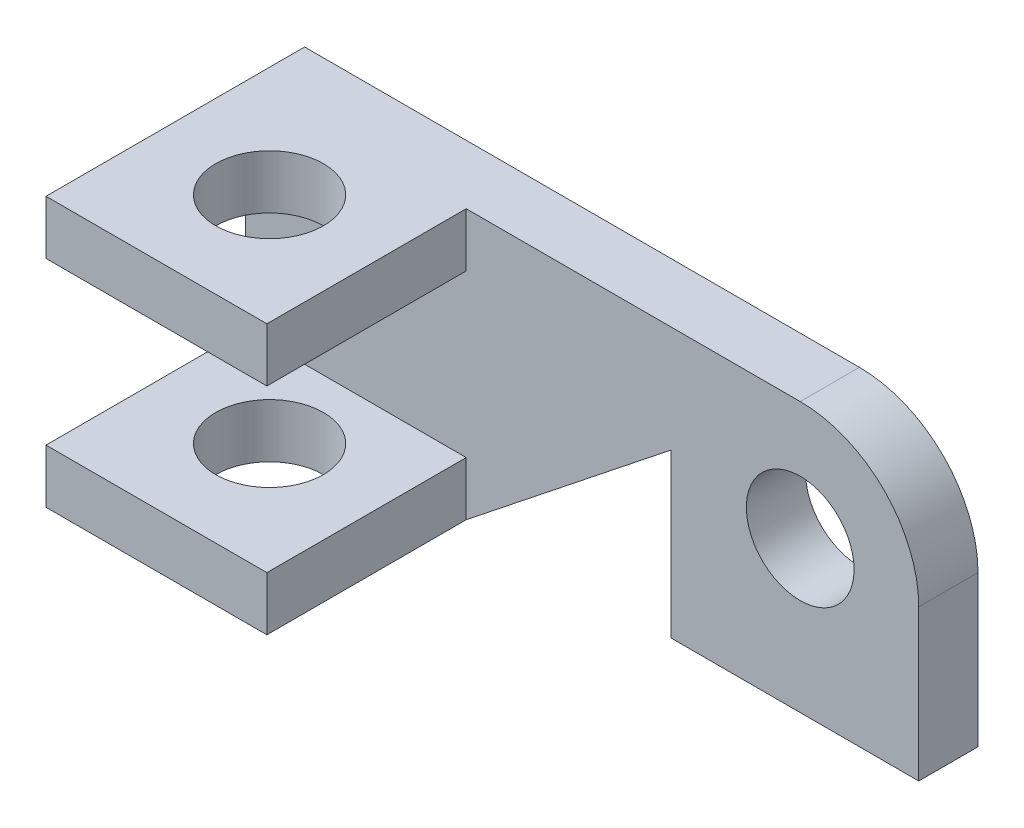
ISO-10303-21;
HEADER;
FILE_DESCRIPTION(('STEP AP214'),'2;1');
FILE_NAME('part.step','',(''),(''),'','','');
FILE_SCHEMA(('AUTOMOTIVE_DESIGN { 1 0 10303 214 1 1 1 1 }'));
ENDSEC;
DATA;
#1=APPLICATION_CONTEXT('core data for automotive mechanical design processes');
#2=APPLICATION_PROTOCOL_DEFINITION('international standard','automotive_design',2000,#1);
#3=PRODUCT_CONTEXT('',#1,'mechanical');
#4=PRODUCT('Part','Part','',(#3));
#5=PRODUCT_RELATED_PRODUCT_CATEGORY('part','',(#4));
#6=PRODUCT_DEFINITION_FORMATION('','',#4);
#7=PRODUCT_DEFINITION_CONTEXT('part definition',#1,'design');
#8=PRODUCT_DEFINITION('design','',#6,#7);
#9=PRODUCT_DEFINITION_SHAPE('','',#8);
#10=(LENGTH_UNIT() NAMED_UNIT(*) SI_UNIT(.MILLI.,.METRE.));
#11=(NAMED_UNIT(*) PLANE_ANGLE_UNIT() SI_UNIT($,.RADIAN.));
#12=(NAMED_UNIT(*) SI_UNIT($,.STERADIAN.) SOLID_ANGLE_UNIT());
#13=UNCERTAINTY_MEASURE_WITH_UNIT(LENGTH_MEASURE(1.E-05),#10,'distance_accuracy_value','');
#14=(GEOMETRIC_REPRESENTATION_CONTEXT(3) GLOBAL_UNCERTAINTY_ASSIGNED_CONTEXT((#13)) GLOBAL_UNIT_ASSIGNED_CONTEXT((#10,
#11,#12)) REPRESENTATION_CONTEXT('',''));
#15=CARTESIAN_POINT('',(0.,0.,0.));
#16=DIRECTION('',(0.,0.,1.));
#17=DIRECTION('',(1.,0.,0.));
#18=AXIS2_PLACEMENT_3D('',#15,#16,#17);
#19=CARTESIAN_POINT('',(103000.,28000.,11000.));
#20=DIRECTION('',(0.,0.,-1.));
#21=DIRECTION('',(-1.,0.,0.));
#22=AXIS2_PLACEMENT_3D('',#19,#20,#21);
#23=PLANE('',#22);
#24=CARTESIAN_POINT('',(103000.,28000.,11000.));
#25=DIRECTION('',(0.,0.,1.));
#26=DIRECTION('',(1.,0.,0.));
#27=AXIS2_PLACEMENT_3D('',#24,#25,#26);
#28=CIRCLE('',#27,10000.);
#29=CARTESIAN_POINT('',(113000.,28000.,11000.));
#30=VERTEX_POINT('',#29);
#31=EDGE_CURVE('E206',#30,#30,#28,.T.);
#32=ORIENTED_EDGE('',*,*,#31,.F.);
#33=EDGE_LOOP('',(#32));
#34=FACE_BOUND('',#33,.T.);
#35=DIRECTION('',(-1.,0.,0.));
#36=VECTOR('',#35,1.);
#37=CARTESIAN_POINT('',(4.16528467062881E-10,10000.,11000.));
#38=LINE('',#37,#36);
#39=CARTESIAN_POINT('',(41000.0000000004,10000.,11000.));
#40=VERTEX_POINT('',#39);
#41=CARTESIAN_POINT('',(0.,10000.,11000.));
#42=VERTEX_POINT('',#41);
#43=EDGE_CURVE('E56',#40,#42,#38,.T.);
#44=ORIENTED_EDGE('',*,*,#43,.F.);
#45=DIRECTION('',(0.,1.,0.));
#46=VECTOR('',#45,1.);
#47=CARTESIAN_POINT('',(41000.0000000004,10000.,11000.));
#48=LINE('',#47,#46);
#49=CARTESIAN_POINT('',(41000.0000000004,0.,11000.));
#50=VERTEX_POINT('',#49);
#51=EDGE_CURVE('E159',#50,#40,#48,.T.);
#52=ORIENTED_EDGE('',*,*,#51,.F.);
#53=DIRECTION('',(0.782900608144122,0.622146797602916,0.));
#54=VECTOR('',#53,1.);
#55=CARTESIAN_POINT('',(41000.,0.,11000.));
#56=LINE('',#55,#54);
#57=CARTESIAN_POINT('',(79000.,30197.4197784232,11000.));
#58=VERTEX_POINT('',#57);
#59=EDGE_CURVE('E231',#50,#58,#56,.T.);
#60=ORIENTED_EDGE('',*,*,#59,.T.);
#61=DIRECTION('',(0.,-1.,0.));
#62=VECTOR('',#61,1.);
#63=CARTESIAN_POINT('',(79000.,30197.4197784232,11000.));
#64=LINE('',#63,#62);
#65=CARTESIAN_POINT('',(79000.,1.4210854715202E-11,11000.));
#66=VERTEX_POINT('',#65);
#67=EDGE_CURVE('E234',#58,#66,#64,.T.);
#68=ORIENTED_EDGE('',*,*,#67,.T.);
#69=DIRECTION('',(1.,0.,0.));
#70=VECTOR('',#69,1.);
#71=CARTESIAN_POINT('',(79000.,1.4210854715202E-11,11000.));
#72=LINE('',#71,#70);
#73=CARTESIAN_POINT('',(125000.,1.4210854715202E-11,11000.));
#74=VERTEX_POINT('',#73);
#75=EDGE_CURVE('E214',#66,#74,#72,.T.);
#76=ORIENTED_EDGE('',*,*,#75,.T.);
#77=DIRECTION('',(0.,1.,0.));
#78=VECTOR('',#77,1.);
#79=CARTESIAN_POINT('',(125000.,1.4210854715202E-11,11000.));
#80=LINE('',#79,#78);
#81=CARTESIAN_POINT('',(125000.,28000.,11000.));
#82=VERTEX_POINT('',#81);
#83=EDGE_CURVE('E218',#74,#82,#80,.T.);
#84=ORIENTED_EDGE('',*,*,#83,.T.);
#85=CARTESIAN_POINT('',(103000.,28000.,11000.));
#86=DIRECTION('',(0.,0.,-1.));
#87=DIRECTION('',(-1.,0.,0.));
#88=AXIS2_PLACEMENT_3D('',#85,#86,#87);
#89=CIRCLE('',#88,22000.);
#90=CARTESIAN_POINT('',(103000.,50000.,11000.));
#91=VERTEX_POINT('',#90);
#92=EDGE_CURVE('E222',#91,#82,#89,.T.);
#93=ORIENTED_EDGE('',*,*,#92,.F.);
#94=DIRECTION('',(-1.,0.,0.));
#95=VECTOR('',#94,1.);
#96=CARTESIAN_POINT('',(103000.,50000.,11000.));
#97=LINE('',#96,#95);
#98=CARTESIAN_POINT('',(41000.,50000.,11000.));
#99=VERTEX_POINT('',#98);
#100=EDGE_CURVE('E226',#91,#99,#97,.T.);
#101=ORIENTED_EDGE('',*,*,#100,.T.);
#102=DIRECTION('',(0.,1.,0.));
#103=VECTOR('',#102,1.);
#104=CARTESIAN_POINT('',(41000.,50000.,11000.));
#105=LINE('',#104,#103);
#106=CARTESIAN_POINT('',(41000.,40000.,11000.));
#107=VERTEX_POINT('',#106);
#108=EDGE_CURVE('E169',#107,#99,#105,.T.);
#109=ORIENTED_EDGE('',*,*,#108,.F.);
#110=DIRECTION('',(1.,0.,0.));
#111=VECTOR('',#110,1.);
#112=CARTESIAN_POINT('',(1.22464679914735E-12,40000.,11000.));
#113=LINE('',#112,#111);
#114=CARTESIAN_POINT('',(0.,40000.,11000.));
#115=VERTEX_POINT('',#114);
#116=EDGE_CURVE('E163',#115,#107,#113,.T.);
#117=ORIENTED_EDGE('',*,*,#116,.F.);
#118=DIRECTION('',(0.,-1.,0.));
#119=VECTOR('',#118,1.);
#120=CARTESIAN_POINT('',(0.,50000.,11000.));
#121=LINE('',#120,#119);
#122=EDGE_CURVE('E61',#115,#42,#121,.T.);
#123=ORIENTED_EDGE('',*,*,#122,.T.);
#124=EDGE_LOOP('',(#44,#52,#60,#68,#76,#84,#93,#101,#109,#117,#123));
#125=FACE_BOUND('',#124,.T.);
#126=ADVANCED_FACE('F39',(#34,#125),#23,.F.);
#127=CARTESIAN_POINT('',(79000.,1.4210854715202E-11,11000.));
#128=DIRECTION('',(0.,1.,0.));
#129=DIRECTION('',(0.,0.,1.));
#130=AXIS2_PLACEMENT_3D('',#127,#128,#129);
#131=PLANE('',#130);
#132=DIRECTION('',(1.,0.,0.));
#133=VECTOR('',#132,1.);
#134=CARTESIAN_POINT('',(79000.,1.4210854715202E-11,0.));
#135=LINE('',#134,#133);
#136=CARTESIAN_POINT('',(79000.,1.4210854715202E-11,0.));
#137=VERTEX_POINT('',#136);
#138=CARTESIAN_POINT('',(125000.,1.4210854715202E-11,0.));
#139=VERTEX_POINT('',#138);
#140=EDGE_CURVE('E210',#137,#139,#135,.T.);
#141=ORIENTED_EDGE('',*,*,#140,.T.);
#142=DIRECTION('',(0.,0.,-1.));
#143=VECTOR('',#142,1.);
#144=CARTESIAN_POINT('',(125000.,1.4210854715202E-11,11000.));
#145=LINE('',#144,#143);
#146=EDGE_CURVE('E11',#74,#139,#145,.T.);
#147=ORIENTED_EDGE('',*,*,#146,.F.);
#148=ORIENTED_EDGE('',*,*,#75,.F.);
#149=DIRECTION('',(0.,0.,-1.));
#150=VECTOR('',#149,1.);
#151=CARTESIAN_POINT('',(79000.,1.4210854715202E-11,11000.));
#152=LINE('',#151,#150);
#153=EDGE_CURVE('E237',#66,#137,#152,.T.);
#154=ORIENTED_EDGE('',*,*,#153,.T.);
#155=EDGE_LOOP('',(#141,#147,#148,#154));
#156=FACE_BOUND('',#155,.T.);
#157=ADVANCED_FACE('F41',(#156),#131,.F.);
#158=CARTESIAN_POINT('',(125000.,1.4210854715202E-11,11000.));
#159=DIRECTION('',(-1.,0.,0.));
#160=DIRECTION('',(0.,0.,1.));
#161=AXIS2_PLACEMENT_3D('',#158,#159,#160);
#162=PLANE('',#161);
#163=DIRECTION('',(0.,1.,0.));
#164=VECTOR('',#163,1.);
#165=CARTESIAN_POINT('',(125000.,1.4210854715202E-11,0.));
#166=LINE('',#165,#164);
#167=CARTESIAN_POINT('',(125000.,28000.,0.));
#168=VERTEX_POINT('',#167);
#169=EDGE_CURVE('E241',#139,#168,#166,.T.);
#170=ORIENTED_EDGE('',*,*,#169,.T.);
#171=DIRECTION('',(0.,0.,-1.));
#172=VECTOR('',#171,1.);
#173=CARTESIAN_POINT('',(125000.,28000.,11000.));
#174=LINE('',#173,#172);
#175=EDGE_CURVE('E49',#82,#168,#174,.T.);
#176=ORIENTED_EDGE('',*,*,#175,.F.);
#177=ORIENTED_EDGE('',*,*,#83,.F.);
#178=ORIENTED_EDGE('',*,*,#146,.T.);
#179=EDGE_LOOP('',(#170,#176,#177,#178));
#180=FACE_BOUND('',#179,.T.);
#181=ADVANCED_FACE('F290',(#180),#162,.F.);
#182=CARTESIAN_POINT('',(103000.,28000.,11000.));
#183=DIRECTION('',(0.,0.,-1.));
#184=DIRECTION('',(-1.,0.,0.));
#185=AXIS2_PLACEMENT_3D('',#182,#183,#184);
#186=CYLINDRICAL_SURFACE('',#185,22000.);
#187=CARTESIAN_POINT('',(103000.,28000.,0.));
#188=DIRECTION('',(0.,0.,-1.));
#189=DIRECTION('',(-1.,0.,0.));
#190=AXIS2_PLACEMENT_3D('',#187,#188,#189);
#191=CIRCLE('',#190,22000.);
#192=CARTESIAN_POINT('',(103000.,50000.,0.));
#193=VERTEX_POINT('',#192);
#194=EDGE_CURVE('E245',#193,#168,#191,.T.);
#195=ORIENTED_EDGE('',*,*,#194,.F.);
#196=DIRECTION('',(0.,0.,-1.));
#197=VECTOR('',#196,1.);
#198=CARTESIAN_POINT('',(103000.,50000.,11000.));
#199=LINE('',#198,#197);
#200=EDGE_CURVE('E280',#91,#193,#199,.T.);
#201=ORIENTED_EDGE('',*,*,#200,.F.);
#202=ORIENTED_EDGE('',*,*,#92,.T.);
#203=ORIENTED_EDGE('',*,*,#175,.T.);
#204=EDGE_LOOP('',(#195,#201,#202,#203));
#205=FACE_BOUND('',#204,.T.);
#206=ADVANCED_FACE('F287',(#205),#186,.T.);
#207=CARTESIAN_POINT('',(103000.,50000.,11000.));
#208=DIRECTION('',(0.,-1.,0.));
#209=DIRECTION('',(1.,0.,0.));
#210=AXIS2_PLACEMENT_3D('',#207,#208,#209);
#211=PLANE('',#210);
#212=CARTESIAN_POINT('',(20500.0000000004,50000.,27000.));
#213=DIRECTION('',(0.,-1.,0.));
#214=DIRECTION('',(0.,0.,-1.));
#215=AXIS2_PLACEMENT_3D('',#212,#213,#214);
#216=CIRCLE('',#215,10000.);
#217=CARTESIAN_POINT('',(20500.0000000004,50000.,17000.));
#218=VERTEX_POINT('',#217);
#219=EDGE_CURVE('E485',#218,#218,#216,.T.);
#220=ORIENTED_EDGE('',*,*,#219,.T.);
#221=EDGE_LOOP('',(#220));
#222=FACE_BOUND('',#221,.T.);
#223=DIRECTION('',(-1.,0.,0.));
#224=VECTOR('',#223,1.);
#225=CARTESIAN_POINT('',(103000.,50000.,0.));
#226=LINE('',#225,#224);
#227=CARTESIAN_POINT('',(0.,50000.,0.));
#228=VERTEX_POINT('',#227);
#229=EDGE_CURVE('E249',#193,#228,#226,.T.);
#230=ORIENTED_EDGE('',*,*,#229,.T.);
#231=DIRECTION('',(0.,0.,-1.));
#232=VECTOR('',#231,1.);
#233=CARTESIAN_POINT('',(0.,50000.,11000.));
#234=LINE('',#233,#232);
#235=CARTESIAN_POINT('',(0.,50000.,48000.));
#236=VERTEX_POINT('',#235);
#237=EDGE_CURVE('E276',#236,#228,#234,.T.);
#238=ORIENTED_EDGE('',*,*,#237,.F.);
#239=DIRECTION('',(-1.,0.,0.));
#240=VECTOR('',#239,1.);
#241=CARTESIAN_POINT('',(0.,50000.,48000.));
#242=LINE('',#241,#240);
#243=CARTESIAN_POINT('',(41000.,50000.,48000.));
#244=VERTEX_POINT('',#243);
#245=EDGE_CURVE('E186',#244,#236,#242,.T.);
#246=ORIENTED_EDGE('',*,*,#245,.F.);
#247=DIRECTION('',(0.,0.,-1.));
#248=VECTOR('',#247,1.);
#249=CARTESIAN_POINT('',(41000.,50000.,48000.));
#250=LINE('',#249,#248);
#251=EDGE_CURVE('E189',#244,#99,#250,.T.);
#252=ORIENTED_EDGE('',*,*,#251,.T.);
#253=ORIENTED_EDGE('',*,*,#100,.F.);
#254=ORIENTED_EDGE('',*,*,#200,.T.);
#255=EDGE_LOOP('',(#230,#238,#246,#252,#253,#254));
#256=FACE_BOUND('',#255,.T.);
#257=ADVANCED_FACE('F299',(#222,#256),#211,.F.);
#258=CARTESIAN_POINT('',(0.,50000.,11000.));
#259=DIRECTION('',(1.,0.,0.));
#260=DIRECTION('',(0.,0.,-1.));
#261=AXIS2_PLACEMENT_3D('',#258,#259,#260);
#262=PLANE('',#261);
#263=DIRECTION('',(0.,-1.,0.));
#264=VECTOR('',#263,1.);
#265=CARTESIAN_POINT('',(0.,50000.,0.));
#266=LINE('',#265,#264);
#267=CARTESIAN_POINT('',(0.,0.,0.));
#268=VERTEX_POINT('',#267);
#269=EDGE_CURVE('E252',#228,#268,#266,.T.);
#270=ORIENTED_EDGE('',*,*,#269,.T.);
#271=DIRECTION('',(0.,0.,-1.));
#272=VECTOR('',#271,1.);
#273=CARTESIAN_POINT('',(0.,0.,11000.));
#274=LINE('',#273,#272);
#275=CARTESIAN_POINT('',(4.17753113862029E-10,0.,48000.));
#276=VERTEX_POINT('',#275);
#277=EDGE_CURVE('E144',#276,#268,#274,.T.);
#278=ORIENTED_EDGE('',*,*,#277,.F.);
#279=DIRECTION('',(0.,-1.,0.));
#280=VECTOR('',#279,1.);
#281=CARTESIAN_POINT('',(4.16528467062881E-10,10000.,48000.));
#282=LINE('',#281,#280);
#283=CARTESIAN_POINT('',(4.16528467062881E-10,10000.,48000.));
#284=VERTEX_POINT('',#283);
#285=EDGE_CURVE('E138',#284,#276,#282,.T.);
#286=ORIENTED_EDGE('',*,*,#285,.F.);
#287=DIRECTION('',(0.,0.,-1.));
#288=VECTOR('',#287,1.);
#289=CARTESIAN_POINT('',(4.16528467062881E-10,10000.,48000.));
#290=LINE('',#289,#288);
#291=EDGE_CURVE('E142',#284,#42,#290,.T.);
#292=ORIENTED_EDGE('',*,*,#291,.T.);
#293=ORIENTED_EDGE('',*,*,#122,.F.);
#294=DIRECTION('',(0.,0.,-1.));
#295=VECTOR('',#294,1.);
#296=CARTESIAN_POINT('',(1.22464679914735E-12,40000.,48000.));
#297=LINE('',#296,#295);
#298=CARTESIAN_POINT('',(1.22464679914735E-12,40000.,48000.));
#299=VERTEX_POINT('',#298);
#300=EDGE_CURVE('E201',#299,#115,#297,.T.);
#301=ORIENTED_EDGE('',*,*,#300,.F.);
#302=DIRECTION('',(0.,-1.,0.));
#303=VECTOR('',#302,1.);
#304=CARTESIAN_POINT('',(0.,50000.,48000.));
#305=LINE('',#304,#303);
#306=EDGE_CURVE('E176',#236,#299,#305,.T.);
#307=ORIENTED_EDGE('',*,*,#306,.F.);
#308=ORIENTED_EDGE('',*,*,#237,.T.);
#309=EDGE_LOOP('',(#270,#278,#286,#292,#293,#301,#307,#308));
#310=FACE_BOUND('',#309,.T.);
#311=ADVANCED_FACE('F140',(#310),#262,.F.);
#312=CARTESIAN_POINT('',(0.,0.,11000.));
#313=DIRECTION('',(0.,1.,0.));
#314=DIRECTION('',(0.,0.,1.));
#315=AXIS2_PLACEMENT_3D('',#312,#313,#314);
#316=PLANE('',#315);
#317=CARTESIAN_POINT('',(20500.0000000004,0.,27000.));
#318=DIRECTION('',(0.,-1.,0.));
#319=DIRECTION('',(0.,0.,-1.));
#320=AXIS2_PLACEMENT_3D('',#317,#318,#319);
#321=CIRCLE('',#320,10000.);
#322=CARTESIAN_POINT('',(20500.0000000004,0.,17000.));
#323=VERTEX_POINT('',#322);
#324=EDGE_CURVE('E495',#323,#323,#321,.T.);
#325=ORIENTED_EDGE('',*,*,#324,.F.);
#326=EDGE_LOOP('',(#325));
#327=FACE_BOUND('',#326,.T.);
#328=DIRECTION('',(1.,0.,0.));
#329=VECTOR('',#328,1.);
#330=CARTESIAN_POINT('',(0.,0.,0.));
#331=LINE('',#330,#329);
#332=CARTESIAN_POINT('',(41000.,0.,0.));
#333=VERTEX_POINT('',#332);
#334=EDGE_CURVE('E255',#268,#333,#331,.T.);
#335=ORIENTED_EDGE('',*,*,#334,.T.);
#336=DIRECTION('',(0.,0.,-1.));
#337=VECTOR('',#336,1.);
#338=CARTESIAN_POINT('',(41000.,0.,11000.));
#339=LINE('',#338,#337);
#340=EDGE_CURVE('E270',#50,#333,#339,.T.);
#341=ORIENTED_EDGE('',*,*,#340,.F.);
#342=DIRECTION('',(0.,0.,-1.));
#343=VECTOR('',#342,1.);
#344=CARTESIAN_POINT('',(41000.0000000004,0.,48000.));
#345=LINE('',#344,#343);
#346=CARTESIAN_POINT('',(41000.0000000004,0.,48000.));
#347=VERTEX_POINT('',#346);
#348=EDGE_CURVE('E164',#347,#50,#345,.T.);
#349=ORIENTED_EDGE('',*,*,#348,.F.);
#350=DIRECTION('',(1.,0.,0.));
#351=VECTOR('',#350,1.);
#352=CARTESIAN_POINT('',(4.17753113862029E-10,0.,48000.));
#353=LINE('',#352,#351);
#354=EDGE_CURVE('E148',#276,#347,#353,.T.);
#355=ORIENTED_EDGE('',*,*,#354,.F.);
#356=ORIENTED_EDGE('',*,*,#277,.T.);
#357=EDGE_LOOP('',(#335,#341,#349,#355,#356));
#358=FACE_BOUND('',#357,.T.);
#359=ADVANCED_FACE('F344',(#327,#358),#316,.F.);
#360=CARTESIAN_POINT('',(41000.,0.,11000.));
#361=DIRECTION('',(-0.622146797602916,0.782900608144122,0.));
#362=DIRECTION('',(-0.782900608144122,-0.622146797602916,0.));
#363=AXIS2_PLACEMENT_3D('',#360,#361,#362);
#364=PLANE('',#363);
#365=DIRECTION('',(0.782900608144122,0.622146797602916,0.));
#366=VECTOR('',#365,1.);
#367=CARTESIAN_POINT('',(41000.,0.,0.));
#368=LINE('',#367,#366);
#369=CARTESIAN_POINT('',(79000.,30197.4197784232,0.));
#370=VERTEX_POINT('',#369);
#371=EDGE_CURVE('E258',#333,#370,#368,.T.);
#372=ORIENTED_EDGE('',*,*,#371,.T.);
#373=DIRECTION('',(0.,0.,-1.));
#374=VECTOR('',#373,1.);
#375=CARTESIAN_POINT('',(79000.,30197.4197784232,11000.));
#376=LINE('',#375,#374);
#377=EDGE_CURVE('E266',#58,#370,#376,.T.);
#378=ORIENTED_EDGE('',*,*,#377,.F.);
#379=ORIENTED_EDGE('',*,*,#59,.F.);
#380=ORIENTED_EDGE('',*,*,#340,.T.);
#381=EDGE_LOOP('',(#372,#378,#379,#380));
#382=FACE_BOUND('',#381,.T.);
#383=ADVANCED_FACE('F340',(#382),#364,.F.);
#384=CARTESIAN_POINT('',(79000.,30197.4197784232,11000.));
#385=DIRECTION('',(1.,0.,0.));
#386=DIRECTION('',(0.,0.,-1.));
#387=AXIS2_PLACEMENT_3D('',#384,#385,#386);
#388=PLANE('',#387);
#389=DIRECTION('',(0.,-1.,0.));
#390=VECTOR('',#389,1.);
#391=CARTESIAN_POINT('',(79000.,30197.4197784232,0.));
#392=LINE('',#391,#390);
#393=EDGE_CURVE('E219',#370,#137,#392,.T.);
#394=ORIENTED_EDGE('',*,*,#393,.T.);
#395=ORIENTED_EDGE('',*,*,#153,.F.);
#396=ORIENTED_EDGE('',*,*,#67,.F.);
#397=ORIENTED_EDGE('',*,*,#377,.T.);
#398=EDGE_LOOP('',(#394,#395,#396,#397));
#399=FACE_BOUND('',#398,.T.);
#400=ADVANCED_FACE('F336',(#399),#388,.F.);
#401=CARTESIAN_POINT('',(103000.,28000.,0.));
#402=DIRECTION('',(0.,0.,-1.));
#403=DIRECTION('',(-1.,0.,0.));
#404=AXIS2_PLACEMENT_3D('',#401,#402,#403);
#405=PLANE('',#404);
#406=CARTESIAN_POINT('',(103000.,28000.,0.));
#407=DIRECTION('',(0.,0.,1.));
#408=DIRECTION('',(1.,0.,0.));
#409=AXIS2_PLACEMENT_3D('',#406,#407,#408);
#410=CIRCLE('',#409,10000.);
#411=CARTESIAN_POINT('',(113000.,28000.,0.));
#412=VERTEX_POINT('',#411);
#413=EDGE_CURVE('E205',#412,#412,#410,.T.);
#414=ORIENTED_EDGE('',*,*,#413,.T.);
#415=EDGE_LOOP('',(#414));
#416=FACE_BOUND('',#415,.T.);
#417=ORIENTED_EDGE('',*,*,#140,.F.);
#418=ORIENTED_EDGE('',*,*,#393,.F.);
#419=ORIENTED_EDGE('',*,*,#371,.F.);
#420=ORIENTED_EDGE('',*,*,#334,.F.);
#421=ORIENTED_EDGE('',*,*,#269,.F.);
#422=ORIENTED_EDGE('',*,*,#229,.F.);
#423=ORIENTED_EDGE('',*,*,#194,.T.);
#424=ORIENTED_EDGE('',*,*,#169,.F.);
#425=EDGE_LOOP('',(#417,#418,#419,#420,#421,#422,#423,#424));
#426=FACE_BOUND('',#425,.T.);
#427=ADVANCED_FACE('F295',(#416,#426),#405,.T.);
#428=CARTESIAN_POINT('',(103000.,28000.,11000.));
#429=DIRECTION('',(0.,0.,-1.));
#430=DIRECTION('',(-1.,0.,0.));
#431=AXIS2_PLACEMENT_3D('',#428,#429,#430);
#432=CYLINDRICAL_SURFACE('',#431,10000.);
#433=ORIENTED_EDGE('',*,*,#31,.T.);
#434=EDGE_LOOP('',(#433));
#435=FACE_BOUND('',#434,.T.);
#436=ORIENTED_EDGE('',*,*,#413,.F.);
#437=EDGE_LOOP('',(#436));
#438=FACE_BOUND('',#437,.T.);
#439=ADVANCED_FACE('F314',(#435,#438),#432,.F.);
#440=CARTESIAN_POINT('',(1.22464679914735E-12,40000.,48000.));
#441=DIRECTION('',(0.,1.,0.));
#442=DIRECTION('',(0.,0.,1.));
#443=AXIS2_PLACEMENT_3D('',#440,#441,#442);
#444=PLANE('',#443);
#445=CARTESIAN_POINT('',(20500.0000000004,40000.,27000.));
#446=DIRECTION('',(0.,1.,0.));
#447=DIRECTION('',(0.,0.,1.));
#448=AXIS2_PLACEMENT_3D('',#445,#446,#447);
#449=CIRCLE('',#448,10000.);
#450=CARTESIAN_POINT('',(20500.0000000004,40000.,17000.));
#451=VERTEX_POINT('',#450);
#452=EDGE_CURVE('E487',#451,#451,#449,.T.);
#453=ORIENTED_EDGE('',*,*,#452,.T.);
#454=EDGE_LOOP('',(#453));
#455=FACE_BOUND('',#454,.T.);
#456=ORIENTED_EDGE('',*,*,#116,.T.);
#457=DIRECTION('',(0.,0.,-1.));
#458=VECTOR('',#457,1.);
#459=CARTESIAN_POINT('',(41000.,40000.,48000.));
#460=LINE('',#459,#458);
#461=CARTESIAN_POINT('',(41000.,40000.,48000.));
#462=VERTEX_POINT('',#461);
#463=EDGE_CURVE('E197',#462,#107,#460,.T.);
#464=ORIENTED_EDGE('',*,*,#463,.F.);
#465=DIRECTION('',(1.,0.,0.));
#466=VECTOR('',#465,1.);
#467=CARTESIAN_POINT('',(1.22464679914735E-12,40000.,48000.));
#468=LINE('',#467,#466);
#469=EDGE_CURVE('E180',#299,#462,#468,.T.);
#470=ORIENTED_EDGE('',*,*,#469,.F.);
#471=ORIENTED_EDGE('',*,*,#300,.T.);
#472=EDGE_LOOP('',(#456,#464,#470,#471));
#473=FACE_BOUND('',#472,.T.);
#474=ADVANCED_FACE('F312',(#455,#473),#444,.F.);
#475=CARTESIAN_POINT('',(41000.,50000.,48000.));
#476=DIRECTION('',(-1.,0.,0.));
#477=DIRECTION('',(0.,0.,1.));
#478=AXIS2_PLACEMENT_3D('',#475,#476,#477);
#479=PLANE('',#478);
#480=ORIENTED_EDGE('',*,*,#108,.T.);
#481=ORIENTED_EDGE('',*,*,#251,.F.);
#482=DIRECTION('',(0.,1.,0.));
#483=VECTOR('',#482,1.);
#484=CARTESIAN_POINT('',(41000.,50000.,48000.));
#485=LINE('',#484,#483);
#486=EDGE_CURVE('E183',#462,#244,#485,.T.);
#487=ORIENTED_EDGE('',*,*,#486,.F.);
#488=ORIENTED_EDGE('',*,*,#463,.T.);
#489=EDGE_LOOP('',(#480,#481,#487,#488));
#490=FACE_BOUND('',#489,.T.);
#491=ADVANCED_FACE('F310',(#490),#479,.F.);
#492=CARTESIAN_POINT('',(0.,0.,48000.));
#493=DIRECTION('',(0.,0.,1.));
#494=DIRECTION('',(1.,0.,0.));
#495=AXIS2_PLACEMENT_3D('',#492,#493,#494);
#496=PLANE('',#495);
#497=ORIENTED_EDGE('',*,*,#306,.T.);
#498=ORIENTED_EDGE('',*,*,#469,.T.);
#499=ORIENTED_EDGE('',*,*,#486,.T.);
#500=ORIENTED_EDGE('',*,*,#245,.T.);
#501=EDGE_LOOP('',(#497,#498,#499,#500));
#502=FACE_BOUND('',#501,.T.);
#503=ADVANCED_FACE('F305',(#502),#496,.T.);
#504=CARTESIAN_POINT('',(4.16528467062881E-10,10000.,48000.));
#505=DIRECTION('',(0.,-1.,0.));
#506=DIRECTION('',(0.,0.,-1.));
#507=AXIS2_PLACEMENT_3D('',#504,#505,#506);
#508=PLANE('',#507);
#509=CARTESIAN_POINT('',(20500.0000000004,10000.,27000.));
#510=DIRECTION('',(0.,-1.,0.));
#511=DIRECTION('',(0.,0.,-1.));
#512=AXIS2_PLACEMENT_3D('',#509,#510,#511);
#513=CIRCLE('',#512,10000.);
#514=CARTESIAN_POINT('',(20500.0000000004,10000.,17000.));
#515=VERTEX_POINT('',#514);
#516=EDGE_CURVE('E43',#515,#515,#513,.T.);
#517=ORIENTED_EDGE('',*,*,#516,.T.);
#518=EDGE_LOOP('',(#517));
#519=FACE_BOUND('',#518,.T.);
#520=ORIENTED_EDGE('',*,*,#43,.T.);
#521=ORIENTED_EDGE('',*,*,#291,.F.);
#522=DIRECTION('',(-1.,0.,0.));
#523=VECTOR('',#522,1.);
#524=CARTESIAN_POINT('',(4.16528467062881E-10,10000.,48000.));
#525=LINE('',#524,#523);
#526=CARTESIAN_POINT('',(41000.0000000004,10000.,48000.));
#527=VERTEX_POINT('',#526);
#528=EDGE_CURVE('E149',#527,#284,#525,.T.);
#529=ORIENTED_EDGE('',*,*,#528,.F.);
#530=DIRECTION('',(0.,0.,-1.));
#531=VECTOR('',#530,1.);
#532=CARTESIAN_POINT('',(41000.0000000004,10000.,48000.));
#533=LINE('',#532,#531);
#534=EDGE_CURVE('E172',#527,#40,#533,.T.);
#535=ORIENTED_EDGE('',*,*,#534,.T.);
#536=EDGE_LOOP('',(#520,#521,#529,#535));
#537=FACE_BOUND('',#536,.T.);
#538=ADVANCED_FACE('F161',(#519,#537),#508,.F.);
#539=CARTESIAN_POINT('',(41000.0000000004,10000.,48000.));
#540=DIRECTION('',(-1.,0.,0.));
#541=DIRECTION('',(0.,0.,1.));
#542=AXIS2_PLACEMENT_3D('',#539,#540,#541);
#543=PLANE('',#542);
#544=ORIENTED_EDGE('',*,*,#51,.T.);
#545=ORIENTED_EDGE('',*,*,#534,.F.);
#546=DIRECTION('',(0.,1.,0.));
#547=VECTOR('',#546,1.);
#548=CARTESIAN_POINT('',(41000.0000000004,10000.,48000.));
#549=LINE('',#548,#547);
#550=EDGE_CURVE('E154',#347,#527,#549,.T.);
#551=ORIENTED_EDGE('',*,*,#550,.F.);
#552=ORIENTED_EDGE('',*,*,#348,.T.);
#553=EDGE_LOOP('',(#544,#545,#551,#552));
#554=FACE_BOUND('',#553,.T.);
#555=ADVANCED_FACE('F442',(#554),#543,.F.);
#556=CARTESIAN_POINT('',(0.,0.,48000.));
#557=DIRECTION('',(0.,0.,-1.));
#558=DIRECTION('',(-1.,0.,0.));
#559=AXIS2_PLACEMENT_3D('',#556,#557,#558);
#560=PLANE('',#559);
#561=ORIENTED_EDGE('',*,*,#528,.T.);
#562=ORIENTED_EDGE('',*,*,#285,.T.);
#563=ORIENTED_EDGE('',*,*,#354,.T.);
#564=ORIENTED_EDGE('',*,*,#550,.T.);
#565=EDGE_LOOP('',(#561,#562,#563,#564));
#566=FACE_BOUND('',#565,.T.);
#567=ADVANCED_FACE('F152',(#566),#560,.F.);
#568=CARTESIAN_POINT('',(20500.0000000004,50000.,27000.));
#569=DIRECTION('',(0.,-1.,0.));
#570=DIRECTION('',(0.,0.,-1.));
#571=AXIS2_PLACEMENT_3D('',#568,#569,#570);
#572=CYLINDRICAL_SURFACE('',#571,10000.);
#573=CARTESIAN_POINT('',(20500.0000000004,0.,17000.));
#574=CARTESIAN_POINT('',(20500.0000000004,104.166666666667,17000.));
#575=CARTESIAN_POINT('',(20500.0000000004,208.333333333333,17000.));
#576=CARTESIAN_POINT('',(20500.0000000004,416.666666666667,17000.));
#577=CARTESIAN_POINT('',(20500.0000000004,520.833333333333,17000.));
#578=CARTESIAN_POINT('',(20500.0000000004,729.166666666667,17000.));
#579=CARTESIAN_POINT('',(20500.0000000004,833.333333333333,17000.));
#580=CARTESIAN_POINT('',(20500.0000000004,1041.66666666667,17000.));
#581=CARTESIAN_POINT('',(20500.0000000004,1145.83333333333,17000.));
#582=CARTESIAN_POINT('',(20500.0000000004,1354.16666666667,17000.));
#583=CARTESIAN_POINT('',(20500.0000000004,1458.33333333333,17000.));
#584=CARTESIAN_POINT('',(20500.0000000004,1666.66666666667,17000.));
#585=CARTESIAN_POINT('',(20500.0000000004,1770.83333333333,17000.));
#586=CARTESIAN_POINT('',(20500.0000000004,1979.16666666667,17000.));
#587=CARTESIAN_POINT('',(20500.0000000004,2083.33333333333,17000.));
#588=CARTESIAN_POINT('',(20500.0000000004,2291.66666666667,17000.));
#589=CARTESIAN_POINT('',(20500.0000000004,2395.83333333333,17000.));
#590=CARTESIAN_POINT('',(20500.0000000004,2604.16666666667,17000.));
#591=CARTESIAN_POINT('',(20500.0000000004,2708.33333333333,17000.));
#592=CARTESIAN_POINT('',(20500.0000000004,2916.66666666667,17000.));
#593=CARTESIAN_POINT('',(20500.0000000004,3020.83333333333,17000.));
#594=CARTESIAN_POINT('',(20500.0000000004,3229.16666666667,17000.));
#595=CARTESIAN_POINT('',(20500.0000000004,3333.33333333333,17000.));
#596=CARTESIAN_POINT('',(20500.0000000004,3541.66666666667,17000.));
#597=CARTESIAN_POINT('',(20500.0000000004,3645.83333333333,17000.));
#598=CARTESIAN_POINT('',(20500.0000000004,3854.16666666667,17000.));
#599=CARTESIAN_POINT('',(20500.0000000004,3958.33333333333,17000.));
#600=CARTESIAN_POINT('',(20500.0000000004,4166.66666666667,17000.));
#601=CARTESIAN_POINT('',(20500.0000000004,4270.83333333333,17000.));
#602=CARTESIAN_POINT('',(20500.0000000004,4479.16666666667,17000.));
#603=CARTESIAN_POINT('',(20500.0000000004,4583.33333333333,17000.));
#604=CARTESIAN_POINT('',(20500.0000000004,4791.66666666667,17000.));
#605=CARTESIAN_POINT('',(20500.0000000004,4895.83333333333,17000.));
#606=CARTESIAN_POINT('',(20500.0000000004,5104.16666666667,17000.));
#607=CARTESIAN_POINT('',(20500.0000000004,5208.33333333333,17000.));
#608=CARTESIAN_POINT('',(20500.0000000004,5416.66666666667,17000.));
#609=CARTESIAN_POINT('',(20500.0000000004,5520.83333333333,17000.));
#610=CARTESIAN_POINT('',(20500.0000000004,5729.16666666667,17000.));
#611=CARTESIAN_POINT('',(20500.0000000004,5833.33333333333,17000.));
#612=CARTESIAN_POINT('',(20500.0000000004,6041.66666666667,17000.));
#613=CARTESIAN_POINT('',(20500.0000000004,6145.83333333333,17000.));
#614=CARTESIAN_POINT('',(20500.0000000004,6354.16666666667,17000.));
#615=CARTESIAN_POINT('',(20500.0000000004,6458.33333333333,17000.));
#616=CARTESIAN_POINT('',(20500.0000000004,6666.66666666667,17000.));
#617=CARTESIAN_POINT('',(20500.0000000004,6770.83333333333,17000.));
#618=CARTESIAN_POINT('',(20500.0000000004,6979.16666666667,17000.));
#619=CARTESIAN_POINT('',(20500.0000000004,7083.33333333333,17000.));
#620=CARTESIAN_POINT('',(20500.0000000004,7291.66666666667,17000.));
#621=CARTESIAN_POINT('',(20500.0000000004,7395.83333333333,17000.));
#622=CARTESIAN_POINT('',(20500.0000000004,7604.16666666667,17000.));
#623=CARTESIAN_POINT('',(20500.0000000004,7708.33333333333,17000.));
#624=CARTESIAN_POINT('',(20500.0000000004,7916.66666666667,17000.));
#625=CARTESIAN_POINT('',(20500.0000000004,8020.83333333333,17000.));
#626=CARTESIAN_POINT('',(20500.0000000004,8229.16666666667,17000.));
#627=CARTESIAN_POINT('',(20500.0000000004,8333.33333333333,17000.));
#628=CARTESIAN_POINT('',(20500.0000000004,8541.66666666667,17000.));
#629=CARTESIAN_POINT('',(20500.0000000004,8645.83333333333,17000.));
#630=CARTESIAN_POINT('',(20500.0000000004,8854.16666666667,17000.));
#631=CARTESIAN_POINT('',(20500.0000000004,8958.33333333333,17000.));
#632=CARTESIAN_POINT('',(20500.0000000004,9166.66666666667,17000.));
#633=CARTESIAN_POINT('',(20500.0000000004,9270.83333333333,17000.));
#634=CARTESIAN_POINT('',(20500.0000000004,9479.16666666667,17000.));
#635=CARTESIAN_POINT('',(20500.0000000004,9583.33333333333,17000.));
#636=CARTESIAN_POINT('',(20500.0000000004,9791.66666666667,17000.));
#637=CARTESIAN_POINT('',(20500.0000000004,9895.83333333333,17000.));
#638=CARTESIAN_POINT('',(20500.0000000004,10000.,17000.));
#639=B_SPLINE_CURVE_WITH_KNOTS('',3,(#573,#574,#575,#576,#577,#578,#579,#580,#581,#582,#583,
#584,#585,#586,#587,#588,#589,#590,#591,#592,#593,#594,#595,#596,#597,#598,#599,#600,#601,#602,
#603,#604,#605,#606,#607,#608,#609,#610,#611,#612,#613,#614,#615,#616,#617,#618,#619,#620,#621,
#622,#623,#624,#625,#626,#627,#628,#629,#630,#631,#632,#633,#634,#635,#636,#637,#638),
.UNSPECIFIED.,.F.,.F.,(4,2,2,2,2,2,2,2,2,2,2,2,2,2,2,2,2,2,2,2,2,2,2,2,2,2,2,2,2,2,2,2,4),(0.,
312.5,625.,937.5,1250.,1562.5,1875.,2187.5,2500.,2812.5,3125.,3437.5,3750.,4062.5,4375.,4687.5,
5000.,5312.5,5625.,5937.5,6250.,6562.5,6875.,7187.5,7500.,7812.5,8125.,8437.5,8750.,9062.5,
9375.,9687.5,10000.),.UNSPECIFIED.);
#640=EDGE_CURVE('BSEAM458',#323,#515,#639,.T.);
#641=ORIENTED_EDGE('',*,*,#324,.T.);
#642=ORIENTED_EDGE('',*,*,#516,.F.);
#643=ORIENTED_EDGE('',*,*,#640,.T.);
#644=ORIENTED_EDGE('',*,*,#640,.F.);
#645=EDGE_LOOP('',(#641,#643,#642,#644));
#646=FACE_BOUND('',#645,.T.);
#647=ADVANCED_FACE('F458',(#646),#572,.F.);
#648=CARTESIAN_POINT('',(20500.0000000004,50000.,17000.));
#649=CARTESIAN_POINT('',(20500.0000000004,49895.8333333334,17000.));
#650=CARTESIAN_POINT('',(20500.0000000004,49791.6666666667,17000.));
#651=CARTESIAN_POINT('',(20500.0000000004,49583.3333333334,17000.));
#652=CARTESIAN_POINT('',(20500.0000000004,49479.1666666667,17000.));
#653=CARTESIAN_POINT('',(20500.0000000004,49270.8333333334,17000.));
#654=CARTESIAN_POINT('',(20500.0000000004,49166.6666666667,17000.));
#655=CARTESIAN_POINT('',(20500.0000000004,48958.3333333334,17000.));
#656=CARTESIAN_POINT('',(20500.0000000004,48854.1666666667,17000.));
#657=CARTESIAN_POINT('',(20500.0000000004,48645.8333333334,17000.));
#658=CARTESIAN_POINT('',(20500.0000000004,48541.6666666667,17000.));
#659=CARTESIAN_POINT('',(20500.0000000004,48333.3333333334,17000.));
#660=CARTESIAN_POINT('',(20500.0000000004,48229.1666666667,17000.));
#661=CARTESIAN_POINT('',(20500.0000000004,48020.8333333334,17000.));
#662=CARTESIAN_POINT('',(20500.0000000004,47916.6666666667,17000.));
#663=CARTESIAN_POINT('',(20500.0000000004,47708.3333333334,17000.));
#664=CARTESIAN_POINT('',(20500.0000000004,47604.1666666667,17000.));
#665=CARTESIAN_POINT('',(20500.0000000004,47395.8333333334,17000.));
#666=CARTESIAN_POINT('',(20500.0000000004,47291.6666666667,17000.));
#667=CARTESIAN_POINT('',(20500.0000000004,47083.3333333334,17000.));
#668=CARTESIAN_POINT('',(20500.0000000004,46979.1666666667,17000.));
#669=CARTESIAN_POINT('',(20500.0000000004,46770.8333333334,17000.));
#670=CARTESIAN_POINT('',(20500.0000000004,46666.6666666667,17000.));
#671=CARTESIAN_POINT('',(20500.0000000004,46458.3333333334,17000.));
#672=CARTESIAN_POINT('',(20500.0000000004,46354.1666666667,17000.));
#673=CARTESIAN_POINT('',(20500.0000000004,46145.8333333334,17000.));
#674=CARTESIAN_POINT('',(20500.0000000004,46041.6666666667,17000.));
#675=CARTESIAN_POINT('',(20500.0000000004,45833.3333333334,17000.));
#676=CARTESIAN_POINT('',(20500.0000000004,45729.1666666667,17000.));
#677=CARTESIAN_POINT('',(20500.0000000004,45520.8333333334,17000.));
#678=CARTESIAN_POINT('',(20500.0000000004,45416.6666666667,17000.));
#679=CARTESIAN_POINT('',(20500.0000000004,45208.3333333333,17000.));
#680=CARTESIAN_POINT('',(20500.0000000004,45104.1666666667,17000.));
#681=CARTESIAN_POINT('',(20500.0000000004,44895.8333333333,17000.));
#682=CARTESIAN_POINT('',(20500.0000000004,44791.6666666667,17000.));
#683=CARTESIAN_POINT('',(20500.0000000004,44583.3333333333,17000.));
#684=CARTESIAN_POINT('',(20500.0000000004,44479.1666666667,17000.));
#685=CARTESIAN_POINT('',(20500.0000000004,44270.8333333333,17000.));
#686=CARTESIAN_POINT('',(20500.0000000004,44166.6666666667,17000.));
#687=CARTESIAN_POINT('',(20500.0000000004,43958.3333333333,17000.));
#688=CARTESIAN_POINT('',(20500.0000000004,43854.1666666667,17000.));
#689=CARTESIAN_POINT('',(20500.0000000004,43645.8333333333,17000.));
#690=CARTESIAN_POINT('',(20500.0000000004,43541.6666666667,17000.));
#691=CARTESIAN_POINT('',(20500.0000000004,43333.3333333333,17000.));
#692=CARTESIAN_POINT('',(20500.0000000004,43229.1666666667,17000.));
#693=CARTESIAN_POINT('',(20500.0000000004,43020.8333333333,17000.));
#694=CARTESIAN_POINT('',(20500.0000000004,42916.6666666667,17000.));
#695=CARTESIAN_POINT('',(20500.0000000004,42708.3333333333,17000.));
#696=CARTESIAN_POINT('',(20500.0000000004,42604.1666666667,17000.));
#697=CARTESIAN_POINT('',(20500.0000000004,42395.8333333333,17000.));
#698=CARTESIAN_POINT('',(20500.0000000004,42291.6666666667,17000.));
#699=CARTESIAN_POINT('',(20500.0000000004,42083.3333333333,17000.));
#700=CARTESIAN_POINT('',(20500.0000000004,41979.1666666667,17000.));
#701=CARTESIAN_POINT('',(20500.0000000004,41770.8333333333,17000.));
#702=CARTESIAN_POINT('',(20500.0000000004,41666.6666666667,17000.));
#703=CARTESIAN_POINT('',(20500.0000000004,41458.3333333333,17000.));
#704=CARTESIAN_POINT('',(20500.0000000004,41354.1666666667,17000.));
#705=CARTESIAN_POINT('',(20500.0000000004,41145.8333333333,17000.));
#706=CARTESIAN_POINT('',(20500.0000000004,41041.6666666667,17000.));
#707=CARTESIAN_POINT('',(20500.0000000004,40833.3333333333,17000.));
#708=CARTESIAN_POINT('',(20500.0000000004,40729.1666666667,17000.));
#709=CARTESIAN_POINT('',(20500.0000000004,40520.8333333333,17000.));
#710=CARTESIAN_POINT('',(20500.0000000004,40416.6666666667,17000.));
#711=CARTESIAN_POINT('',(20500.0000000004,40208.3333333333,17000.));
#712=CARTESIAN_POINT('',(20500.0000000004,40104.1666666667,17000.));
#713=CARTESIAN_POINT('',(20500.0000000004,40000.,17000.));
#714=B_SPLINE_CURVE_WITH_KNOTS('',3,(#648,#649,#650,#651,#652,#653,#654,#655,#656,#657,#658,
#659,#660,#661,#662,#663,#664,#665,#666,#667,#668,#669,#670,#671,#672,#673,#674,#675,#676,#677,
#678,#679,#680,#681,#682,#683,#684,#685,#686,#687,#688,#689,#690,#691,#692,#693,#694,#695,#696,
#697,#698,#699,#700,#701,#702,#703,#704,#705,#706,#707,#708,#709,#710,#711,#712,#713),
.UNSPECIFIED.,.F.,.F.,(4,2,2,2,2,2,2,2,2,2,2,2,2,2,2,2,2,2,2,2,2,2,2,2,2,2,2,2,2,2,2,2,4),(0.,
312.5,625.,937.5,1250.,1562.5,1875.,2187.5,2500.00000000001,2812.50000000001,3125.00000000001,
3437.50000000001,3750.00000000001,4062.50000000001,4375.00000000001,4687.50000000001,
5000.00000000001,5312.50000000001,5625.00000000001,5937.50000000001,6250.00000000001,
6562.50000000001,6875.00000000002,7187.50000000002,7500.00000000002,7812.50000000002,
8125.00000000002,8437.50000000002,8750.00000000002,9062.50000000002,9375.00000000002,
9687.50000000002,10000.),.UNSPECIFIED.);
#715=EDGE_CURVE('BSEAM465',#218,#451,#714,.T.);
#716=ORIENTED_EDGE('',*,*,#219,.F.);
#717=ORIENTED_EDGE('',*,*,#452,.F.);
#718=ORIENTED_EDGE('',*,*,#715,.T.);
#719=ORIENTED_EDGE('',*,*,#715,.F.);
#720=EDGE_LOOP('',(#716,#718,#717,#719));
#721=FACE_BOUND('',#720,.T.);
#722=ADVANCED_FACE('F465',(#721),#572,.F.);
#723=CLOSED_SHELL('',(#126,#157,#181,#206,#257,#311,#359,#383,#400,#427,#439,#474,#491,#503,
#538,#555,#567,#647,#722));
#724=MANIFOLD_SOLID_BREP('B2',#723);
#725=ADVANCED_BREP_SHAPE_REPRESENTATION('',(#18,#724),#14);
#726=SHAPE_DEFINITION_REPRESENTATION(#9,#725);
ENDSEC;
END-ISO-10303-21;
